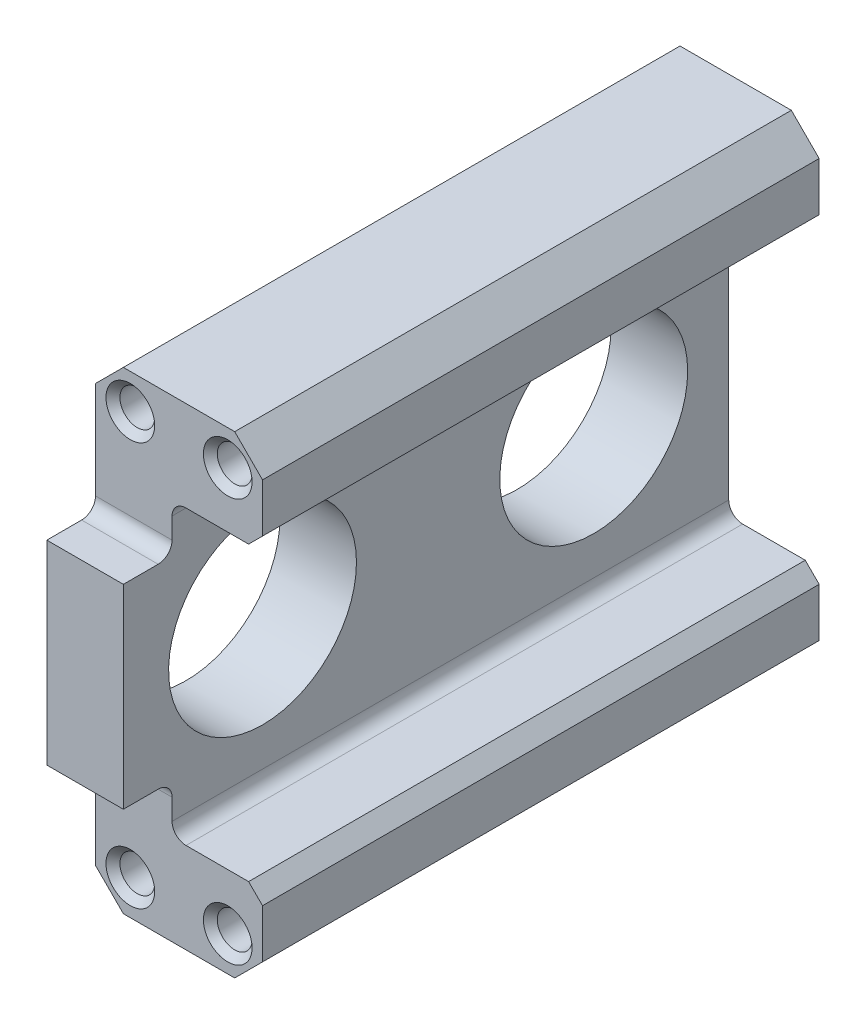
ISO-10303-21;
HEADER;
FILE_DESCRIPTION(('STEP AP214'),'2;1');
FILE_NAME('part.step','',(''),(''),'','','');
FILE_SCHEMA(('AUTOMOTIVE_DESIGN { 1 0 10303 214 1 1 1 1 }'));
ENDSEC;
DATA;
#1=APPLICATION_CONTEXT('core data for automotive mechanical design processes');
#2=APPLICATION_PROTOCOL_DEFINITION('international standard','automotive_design',2000,#1);
#3=PRODUCT_CONTEXT('',#1,'mechanical');
#4=PRODUCT('Part','Part','',(#3));
#5=PRODUCT_RELATED_PRODUCT_CATEGORY('part','',(#4));
#6=PRODUCT_DEFINITION_FORMATION('','',#4);
#7=PRODUCT_DEFINITION_CONTEXT('part definition',#1,'design');
#8=PRODUCT_DEFINITION('design','',#6,#7);
#9=PRODUCT_DEFINITION_SHAPE('','',#8);
#10=(LENGTH_UNIT() NAMED_UNIT(*) SI_UNIT(.MILLI.,.METRE.));
#11=(NAMED_UNIT(*) PLANE_ANGLE_UNIT() SI_UNIT($,.RADIAN.));
#12=(NAMED_UNIT(*) SI_UNIT($,.STERADIAN.) SOLID_ANGLE_UNIT());
#13=UNCERTAINTY_MEASURE_WITH_UNIT(LENGTH_MEASURE(1.E-05),#10,'distance_accuracy_value','');
#14=(GEOMETRIC_REPRESENTATION_CONTEXT(3) GLOBAL_UNCERTAINTY_ASSIGNED_CONTEXT((#13)) GLOBAL_UNIT_ASSIGNED_CONTEXT((#10,
#11,#12)) REPRESENTATION_CONTEXT('',''));
#15=CARTESIAN_POINT('',(0.,0.,0.));
#16=DIRECTION('',(0.,0.,1.));
#17=DIRECTION('',(1.,0.,0.));
#18=AXIS2_PLACEMENT_3D('',#15,#16,#17);
#19=CARTESIAN_POINT('',(6.,-17.,43.5));
#20=DIRECTION('',(-1.,0.,0.));
#21=DIRECTION('',(0.,0.,1.));
#22=AXIS2_PLACEMENT_3D('',#19,#20,#21);
#23=PLANE('',#22);
#24=DIRECTION('',(0.,1.,0.));
#25=VECTOR('',#24,1.);
#26=CARTESIAN_POINT('',(6.,-17.,0.));
#27=LINE('',#26,#25);
#28=CARTESIAN_POINT('',(6.,-15.,0.));
#29=VERTEX_POINT('',#28);
#30=CARTESIAN_POINT('',(6.,-11.5,0.));
#31=VERTEX_POINT('',#30);
#32=EDGE_CURVE('E264',#29,#31,#27,.T.);
#33=ORIENTED_EDGE('',*,*,#32,.T.);
#34=DIRECTION('',(0.,0.,1.));
#35=VECTOR('',#34,1.);
#36=CARTESIAN_POINT('',(6.,-11.5,43.5));
#37=LINE('',#36,#35);
#38=CARTESIAN_POINT('',(6.,-11.5,40.));
#39=VERTEX_POINT('',#38);
#40=EDGE_CURVE('E359',#31,#39,#37,.T.);
#41=ORIENTED_EDGE('',*,*,#40,.T.);
#42=DIRECTION('',(0.,-1.,0.));
#43=VECTOR('',#42,1.);
#44=CARTESIAN_POINT('',(6.,-17.,40.));
#45=LINE('',#44,#43);
#46=CARTESIAN_POINT('',(6.,-15.,40.));
#47=VERTEX_POINT('',#46);
#48=EDGE_CURVE('E230',#39,#47,#45,.T.);
#49=ORIENTED_EDGE('',*,*,#48,.T.);
#50=DIRECTION('',(0.,0.,-1.));
#51=VECTOR('',#50,1.);
#52=CARTESIAN_POINT('',(6.,-15.,43.5));
#53=LINE('',#52,#51);
#54=EDGE_CURVE('E341',#47,#29,#53,.T.);
#55=ORIENTED_EDGE('',*,*,#54,.T.);
#56=EDGE_LOOP('',(#33,#41,#49,#55));
#57=FACE_BOUND('',#56,.T.);
#58=ADVANCED_FACE('F38',(#57),#23,.F.);
#59=DIRECTION('',(0.,1.,0.));
#60=VECTOR('',#59,1.);
#61=CARTESIAN_POINT('',(6.,17.,40.));
#62=LINE('',#61,#60);
#63=CARTESIAN_POINT('',(6.,11.5,40.));
#64=VERTEX_POINT('',#63);
#65=CARTESIAN_POINT('',(6.,15.,40.));
#66=VERTEX_POINT('',#65);
#67=EDGE_CURVE('E245',#64,#66,#62,.T.);
#68=ORIENTED_EDGE('',*,*,#67,.F.);
#69=DIRECTION('',(0.,0.,-1.));
#70=VECTOR('',#69,1.);
#71=CARTESIAN_POINT('',(6.,11.5,43.5));
#72=LINE('',#71,#70);
#73=CARTESIAN_POINT('',(6.,11.5,0.));
#74=VERTEX_POINT('',#73);
#75=EDGE_CURVE('E371',#64,#74,#72,.T.);
#76=ORIENTED_EDGE('',*,*,#75,.T.);
#77=CARTESIAN_POINT('',(6.,15.,0.));
#78=VERTEX_POINT('',#77);
#79=EDGE_CURVE('E261',#74,#78,#27,.T.);
#80=ORIENTED_EDGE('',*,*,#79,.T.);
#81=DIRECTION('',(0.,0.,1.));
#82=VECTOR('',#81,1.);
#83=CARTESIAN_POINT('',(6.,15.,43.5));
#84=LINE('',#83,#82);
#85=EDGE_CURVE('E334',#78,#66,#84,.T.);
#86=ORIENTED_EDGE('',*,*,#85,.T.);
#87=EDGE_LOOP('',(#68,#76,#80,#86));
#88=FACE_BOUND('',#87,.T.);
#89=ADVANCED_FACE('F466',(#88),#23,.F.);
#90=CARTESIAN_POINT('',(-6.,-17.,43.5));
#91=DIRECTION('',(1.,0.,0.));
#92=DIRECTION('',(0.,0.,-1.));
#93=AXIS2_PLACEMENT_3D('',#90,#91,#92);
#94=PLANE('',#93);
#95=CARTESIAN_POINT('',(-6.,0.,33.5));
#96=DIRECTION('',(1.,0.,0.));
#97=DIRECTION('',(0.,0.,-1.));
#98=AXIS2_PLACEMENT_3D('',#95,#96,#97);
#99=CIRCLE('',#98,6.75);
#100=CARTESIAN_POINT('',(-6.,0.,26.75));
#101=VERTEX_POINT('',#100);
#102=EDGE_CURVE('E258',#101,#101,#99,.T.);
#103=ORIENTED_EDGE('',*,*,#102,.T.);
#104=EDGE_LOOP('',(#103));
#105=FACE_BOUND('',#104,.T.);
#106=CARTESIAN_POINT('',(-6.,0.,9.7));
#107=DIRECTION('',(1.,0.,0.));
#108=DIRECTION('',(0.,0.,-1.));
#109=AXIS2_PLACEMENT_3D('',#106,#107,#108);
#110=CIRCLE('',#109,6.75);
#111=CARTESIAN_POINT('',(-6.,0.,2.95));
#112=VERTEX_POINT('',#111);
#113=EDGE_CURVE('E255',#112,#112,#110,.T.);
#114=ORIENTED_EDGE('',*,*,#113,.T.);
#115=EDGE_LOOP('',(#114));
#116=FACE_BOUND('',#115,.T.);
#117=DIRECTION('',(0.,-1.,0.));
#118=VECTOR('',#117,1.);
#119=CARTESIAN_POINT('',(-6.,-17.,0.));
#120=LINE('',#119,#118);
#121=CARTESIAN_POINT('',(-6.,15.,0.));
#122=VERTEX_POINT('',#121);
#123=CARTESIAN_POINT('',(-6.,-15.,0.));
#124=VERTEX_POINT('',#123);
#125=EDGE_CURVE('E270',#122,#124,#120,.T.);
#126=ORIENTED_EDGE('',*,*,#125,.T.);
#127=DIRECTION('',(0.,0.,1.));
#128=VECTOR('',#127,1.);
#129=CARTESIAN_POINT('',(-6.,-15.,43.5));
#130=LINE('',#129,#128);
#131=CARTESIAN_POINT('',(-6.,-15.,40.));
#132=VERTEX_POINT('',#131);
#133=EDGE_CURVE('E357',#124,#132,#130,.T.);
#134=ORIENTED_EDGE('',*,*,#133,.T.);
#135=DIRECTION('',(0.,1.,0.));
#136=VECTOR('',#135,1.);
#137=CARTESIAN_POINT('',(-6.,-17.,40.));
#138=LINE('',#137,#136);
#139=CARTESIAN_POINT('',(-6.,-8.,40.));
#140=VERTEX_POINT('',#139);
#141=EDGE_CURVE('E233',#132,#140,#138,.T.);
#142=ORIENTED_EDGE('',*,*,#141,.T.);
#143=CARTESIAN_POINT('',(-6.,-8.,41.));
#144=DIRECTION('',(1.,0.,0.));
#145=DIRECTION('',(0.,0.,-1.));
#146=AXIS2_PLACEMENT_3D('',#143,#144,#145);
#147=CIRCLE('',#146,1.);
#148=CARTESIAN_POINT('',(-6.,-7.,41.));
#149=VERTEX_POINT('',#148);
#150=EDGE_CURVE('E284',#140,#149,#147,.T.);
#151=ORIENTED_EDGE('',*,*,#150,.T.);
#152=DIRECTION('',(0.,0.,1.));
#153=VECTOR('',#152,1.);
#154=CARTESIAN_POINT('',(-6.,-7.,40.));
#155=LINE('',#154,#153);
#156=CARTESIAN_POINT('',(-6.,-7.,43.5));
#157=VERTEX_POINT('',#156);
#158=EDGE_CURVE('E242',#149,#157,#155,.T.);
#159=ORIENTED_EDGE('',*,*,#158,.T.);
#160=DIRECTION('',(0.,-1.,0.));
#161=VECTOR('',#160,1.);
#162=CARTESIAN_POINT('',(-6.,-17.,43.5));
#163=LINE('',#162,#161);
#164=CARTESIAN_POINT('',(-6.,7.,43.5));
#165=VERTEX_POINT('',#164);
#166=EDGE_CURVE('E229',#165,#157,#163,.T.);
#167=ORIENTED_EDGE('',*,*,#166,.F.);
#168=DIRECTION('',(0.,0.,1.));
#169=VECTOR('',#168,1.);
#170=CARTESIAN_POINT('',(-6.,7.,40.));
#171=LINE('',#170,#169);
#172=CARTESIAN_POINT('',(-6.,7.,41.));
#173=VERTEX_POINT('',#172);
#174=EDGE_CURVE('E252',#173,#165,#171,.T.);
#175=ORIENTED_EDGE('',*,*,#174,.F.);
#176=CARTESIAN_POINT('',(-6.,8.,41.));
#177=DIRECTION('',(1.,0.,0.));
#178=DIRECTION('',(0.,0.,-1.));
#179=AXIS2_PLACEMENT_3D('',#176,#177,#178);
#180=CIRCLE('',#179,1.);
#181=CARTESIAN_POINT('',(-6.,8.,40.));
#182=VERTEX_POINT('',#181);
#183=EDGE_CURVE('E286',#173,#182,#180,.T.);
#184=ORIENTED_EDGE('',*,*,#183,.T.);
#185=DIRECTION('',(0.,-1.,0.));
#186=VECTOR('',#185,1.);
#187=CARTESIAN_POINT('',(-6.,17.,40.));
#188=LINE('',#187,#186);
#189=CARTESIAN_POINT('',(-6.,15.,40.));
#190=VERTEX_POINT('',#189);
#191=EDGE_CURVE('E250',#190,#182,#188,.T.);
#192=ORIENTED_EDGE('',*,*,#191,.F.);
#193=DIRECTION('',(0.,0.,-1.));
#194=VECTOR('',#193,1.);
#195=CARTESIAN_POINT('',(-6.,15.,43.5));
#196=LINE('',#195,#194);
#197=EDGE_CURVE('E354',#190,#122,#196,.T.);
#198=ORIENTED_EDGE('',*,*,#197,.T.);
#199=EDGE_LOOP('',(#126,#134,#142,#151,#159,#167,#175,#184,#192,#198));
#200=FACE_BOUND('',#199,.T.);
#201=ADVANCED_FACE('F447',(#105,#116,#200),#94,.F.);
#202=CARTESIAN_POINT('',(0.,0.,43.5));
#203=DIRECTION('',(0.,0.,-1.));
#204=DIRECTION('',(-1.,0.,0.));
#205=AXIS2_PLACEMENT_3D('',#202,#203,#204);
#206=PLANE('',#205);
#207=DIRECTION('',(1.,0.,0.));
#208=VECTOR('',#207,1.);
#209=CARTESIAN_POINT('',(6.,-7.,43.5));
#210=LINE('',#209,#208);
#211=CARTESIAN_POINT('',(-0.499999999999998,-7.,43.5));
#212=VERTEX_POINT('',#211);
#213=EDGE_CURVE('E220',#157,#212,#210,.T.);
#214=ORIENTED_EDGE('',*,*,#213,.T.);
#215=DIRECTION('',(0.,1.,0.));
#216=VECTOR('',#215,1.);
#217=CARTESIAN_POINT('',(-0.499999999999995,10.5,43.5));
#218=LINE('',#217,#216);
#219=CARTESIAN_POINT('',(-0.499999999999996,7.,43.5));
#220=VERTEX_POINT('',#219);
#221=EDGE_CURVE('E198',#212,#220,#218,.T.);
#222=ORIENTED_EDGE('',*,*,#221,.T.);
#223=DIRECTION('',(1.,0.,0.));
#224=VECTOR('',#223,1.);
#225=CARTESIAN_POINT('',(6.,7.,43.5));
#226=LINE('',#225,#224);
#227=EDGE_CURVE('E244',#165,#220,#226,.T.);
#228=ORIENTED_EDGE('',*,*,#227,.F.);
#229=ORIENTED_EDGE('',*,*,#166,.T.);
#230=EDGE_LOOP('',(#214,#222,#228,#229));
#231=FACE_BOUND('',#230,.T.);
#232=ADVANCED_FACE('F227',(#231),#206,.F.);
#233=CARTESIAN_POINT('',(-6.,17.,43.5));
#234=DIRECTION('',(0.,-1.,0.));
#235=DIRECTION('',(0.,0.,-1.));
#236=AXIS2_PLACEMENT_3D('',#233,#234,#235);
#237=PLANE('',#236);
#238=DIRECTION('',(-1.,0.,0.));
#239=VECTOR('',#238,1.);
#240=CARTESIAN_POINT('',(6.,17.,40.));
#241=LINE('',#240,#239);
#242=CARTESIAN_POINT('',(4.,17.,40.));
#243=VERTEX_POINT('',#242);
#244=CARTESIAN_POINT('',(-4.,17.,40.));
#245=VERTEX_POINT('',#244);
#246=EDGE_CURVE('E247',#243,#245,#241,.T.);
#247=ORIENTED_EDGE('',*,*,#246,.F.);
#248=DIRECTION('',(0.,0.,-1.));
#249=VECTOR('',#248,1.);
#250=CARTESIAN_POINT('',(4.,17.,43.5));
#251=LINE('',#250,#249);
#252=CARTESIAN_POINT('',(4.,17.,0.));
#253=VERTEX_POINT('',#252);
#254=EDGE_CURVE('E322',#243,#253,#251,.T.);
#255=ORIENTED_EDGE('',*,*,#254,.T.);
#256=DIRECTION('',(-1.,0.,0.));
#257=VECTOR('',#256,1.);
#258=CARTESIAN_POINT('',(-6.,17.,0.));
#259=LINE('',#258,#257);
#260=CARTESIAN_POINT('',(-4.,17.,0.));
#261=VERTEX_POINT('',#260);
#262=EDGE_CURVE('E267',#253,#261,#259,.T.);
#263=ORIENTED_EDGE('',*,*,#262,.T.);
#264=DIRECTION('',(0.,0.,1.));
#265=VECTOR('',#264,1.);
#266=CARTESIAN_POINT('',(-4.,17.,43.5));
#267=LINE('',#266,#265);
#268=EDGE_CURVE('E320',#261,#245,#267,.T.);
#269=ORIENTED_EDGE('',*,*,#268,.T.);
#270=EDGE_LOOP('',(#247,#255,#263,#269));
#271=FACE_BOUND('',#270,.T.);
#272=ADVANCED_FACE('F457',(#271),#237,.F.);
#273=CARTESIAN_POINT('',(-6.,-17.,43.5));
#274=DIRECTION('',(0.,1.,0.));
#275=DIRECTION('',(0.,0.,1.));
#276=AXIS2_PLACEMENT_3D('',#273,#274,#275);
#277=PLANE('',#276);
#278=DIRECTION('',(1.,0.,0.));
#279=VECTOR('',#278,1.);
#280=CARTESIAN_POINT('',(-6.,-17.,0.));
#281=LINE('',#280,#279);
#282=CARTESIAN_POINT('',(-4.,-17.,0.));
#283=VERTEX_POINT('',#282);
#284=CARTESIAN_POINT('',(3.99999999999999,-17.,0.));
#285=VERTEX_POINT('',#284);
#286=EDGE_CURVE('E263',#283,#285,#281,.T.);
#287=ORIENTED_EDGE('',*,*,#286,.T.);
#288=DIRECTION('',(0.,0.,1.));
#289=VECTOR('',#288,1.);
#290=CARTESIAN_POINT('',(3.99999999999999,-17.,43.5));
#291=LINE('',#290,#289);
#292=CARTESIAN_POINT('',(3.99999999999999,-17.,40.));
#293=VERTEX_POINT('',#292);
#294=EDGE_CURVE('E347',#285,#293,#291,.T.);
#295=ORIENTED_EDGE('',*,*,#294,.T.);
#296=DIRECTION('',(-1.,0.,0.));
#297=VECTOR('',#296,1.);
#298=CARTESIAN_POINT('',(6.,-17.,40.));
#299=LINE('',#298,#297);
#300=CARTESIAN_POINT('',(-4.,-17.,40.));
#301=VERTEX_POINT('',#300);
#302=EDGE_CURVE('E240',#293,#301,#299,.T.);
#303=ORIENTED_EDGE('',*,*,#302,.T.);
#304=DIRECTION('',(0.,0.,-1.));
#305=VECTOR('',#304,1.);
#306=CARTESIAN_POINT('',(-4.,-17.,43.5));
#307=LINE('',#306,#305);
#308=EDGE_CURVE('E344',#301,#283,#307,.T.);
#309=ORIENTED_EDGE('',*,*,#308,.T.);
#310=EDGE_LOOP('',(#287,#295,#303,#309));
#311=FACE_BOUND('',#310,.T.);
#312=ADVANCED_FACE('F437',(#311),#277,.F.);
#313=CARTESIAN_POINT('',(0.,0.,0.));
#314=DIRECTION('',(0.,0.,-1.));
#315=DIRECTION('',(-1.,0.,0.));
#316=AXIS2_PLACEMENT_3D('',#313,#314,#315);
#317=PLANE('',#316);
#318=DIRECTION('',(-1.,0.,0.));
#319=VECTOR('',#318,1.);
#320=CARTESIAN_POINT('',(12.5,-10.5,0.));
#321=LINE('',#320,#319);
#322=CARTESIAN_POINT('',(5.,-10.5,0.));
#323=VERTEX_POINT('',#322);
#324=CARTESIAN_POINT('',(0.500000000000006,-10.5,0.));
#325=VERTEX_POINT('',#324);
#326=EDGE_CURVE('E213',#323,#325,#321,.T.);
#327=ORIENTED_EDGE('',*,*,#326,.F.);
#328=DIRECTION('',(-0.70710678118655,0.707106781186545,0.));
#329=VECTOR('',#328,1.);
#330=CARTESIAN_POINT('',(-2.75000000000002,-2.75000000000004,0.));
#331=LINE('',#330,#329);
#332=EDGE_CURVE('E369',#323,#31,#331,.F.);
#333=ORIENTED_EDGE('',*,*,#332,.T.);
#334=ORIENTED_EDGE('',*,*,#32,.F.);
#335=DIRECTION('',(0.707106781186549,0.707106781186546,0.));
#336=VECTOR('',#335,1.);
#337=CARTESIAN_POINT('',(10.5,-10.5,0.));
#338=LINE('',#337,#336);
#339=EDGE_CURVE('E329',#29,#285,#338,.F.);
#340=ORIENTED_EDGE('',*,*,#339,.T.);
#341=ORIENTED_EDGE('',*,*,#286,.F.);
#342=DIRECTION('',(0.707106781186546,-0.707106781186549,0.));
#343=VECTOR('',#342,1.);
#344=CARTESIAN_POINT('',(-10.5,-10.5,0.));
#345=LINE('',#344,#343);
#346=EDGE_CURVE('E327',#283,#124,#345,.F.);
#347=ORIENTED_EDGE('',*,*,#346,.T.);
#348=ORIENTED_EDGE('',*,*,#125,.F.);
#349=DIRECTION('',(-0.707106781186549,-0.707106781186546,0.));
#350=VECTOR('',#349,1.);
#351=CARTESIAN_POINT('',(-10.5,10.5,0.));
#352=LINE('',#351,#350);
#353=EDGE_CURVE('E325',#122,#261,#352,.F.);
#354=ORIENTED_EDGE('',*,*,#353,.T.);
#355=ORIENTED_EDGE('',*,*,#262,.F.);
#356=DIRECTION('',(-0.707106781186546,0.707106781186549,0.));
#357=VECTOR('',#356,1.);
#358=CARTESIAN_POINT('',(10.5,10.5,0.));
#359=LINE('',#358,#357);
#360=EDGE_CURVE('E331',#253,#78,#359,.F.);
#361=ORIENTED_EDGE('',*,*,#360,.T.);
#362=ORIENTED_EDGE('',*,*,#79,.F.);
#363=DIRECTION('',(0.70710678118655,0.707106781186545,0.));
#364=VECTOR('',#363,1.);
#365=CARTESIAN_POINT('',(-2.75000000000002,2.75000000000004,0.));
#366=LINE('',#365,#364);
#367=CARTESIAN_POINT('',(5.,10.5,0.));
#368=VERTEX_POINT('',#367);
#369=EDGE_CURVE('E366',#74,#368,#366,.F.);
#370=ORIENTED_EDGE('',*,*,#369,.T.);
#371=DIRECTION('',(1.,0.,0.));
#372=VECTOR('',#371,1.);
#373=CARTESIAN_POINT('',(12.5,10.5,0.));
#374=LINE('',#373,#372);
#375=CARTESIAN_POINT('',(0.500000000000004,10.5,0.));
#376=VERTEX_POINT('',#375);
#377=EDGE_CURVE('E407',#376,#368,#374,.T.);
#378=ORIENTED_EDGE('',*,*,#377,.F.);
#379=CARTESIAN_POINT('',(0.500000000000004,9.5,0.));
#380=DIRECTION('',(0.,0.,-1.));
#381=DIRECTION('',(-1.,0.,0.));
#382=AXIS2_PLACEMENT_3D('',#379,#380,#381);
#383=CIRCLE('',#382,1.);
#384=CARTESIAN_POINT('',(-0.499999999999995,9.5,0.));
#385=VERTEX_POINT('',#384);
#386=EDGE_CURVE('E388',#376,#385,#383,.F.);
#387=ORIENTED_EDGE('',*,*,#386,.T.);
#388=DIRECTION('',(0.,1.,0.));
#389=VECTOR('',#388,1.);
#390=CARTESIAN_POINT('',(-0.499999999999995,10.5,0.));
#391=LINE('',#390,#389);
#392=CARTESIAN_POINT('',(-0.499999999999999,-9.49999999999999,0.));
#393=VERTEX_POINT('',#392);
#394=EDGE_CURVE('E406',#393,#385,#391,.T.);
#395=ORIENTED_EDGE('',*,*,#394,.F.);
#396=CARTESIAN_POINT('',(0.500000000000002,-9.5,0.));
#397=DIRECTION('',(0.,0.,-1.));
#398=DIRECTION('',(-1.,0.,0.));
#399=AXIS2_PLACEMENT_3D('',#396,#397,#398);
#400=CIRCLE('',#399,1.);
#401=EDGE_CURVE('E46',#393,#325,#400,.F.);
#402=ORIENTED_EDGE('',*,*,#401,.T.);
#403=EDGE_LOOP('',(#327,#333,#334,#340,#341,#347,#348,#354,#355,#361,#362,#370,#378,#387,#395,#402));
#404=FACE_BOUND('',#403,.T.);
#405=ADVANCED_FACE('F405',(#404),#317,.T.);
#406=CARTESIAN_POINT('',(-6.,0.,33.5));
#407=DIRECTION('',(1.,0.,0.));
#408=DIRECTION('',(0.,0.,-1.));
#409=AXIS2_PLACEMENT_3D('',#406,#407,#408);
#410=CYLINDRICAL_SURFACE('',#409,6.75);
#411=CARTESIAN_POINT('',(-0.499999999999997,0.,33.5));
#412=DIRECTION('',(-1.,0.,0.));
#413=DIRECTION('',(0.,-1.,0.));
#414=AXIS2_PLACEMENT_3D('',#411,#412,#413);
#415=CIRCLE('',#414,6.75);
#416=CARTESIAN_POINT('',(-0.499999999999998,-6.75,33.5));
#417=VERTEX_POINT('',#416);
#418=EDGE_CURVE('E421',#417,#417,#415,.F.);
#419=ORIENTED_EDGE('',*,*,#418,.T.);
#420=EDGE_LOOP('',(#419));
#421=FACE_BOUND('',#420,.T.);
#422=ORIENTED_EDGE('',*,*,#102,.F.);
#423=EDGE_LOOP('',(#422));
#424=FACE_BOUND('',#423,.T.);
#425=ADVANCED_FACE('F577',(#421,#424),#410,.F.);
#426=CARTESIAN_POINT('',(-6.,0.,9.7));
#427=DIRECTION('',(1.,0.,0.));
#428=DIRECTION('',(0.,0.,-1.));
#429=AXIS2_PLACEMENT_3D('',#426,#427,#428);
#430=CYLINDRICAL_SURFACE('',#429,6.75);
#431=CARTESIAN_POINT('',(-0.499999999999997,0.,9.7));
#432=DIRECTION('',(-1.,0.,0.));
#433=DIRECTION('',(0.,-1.,0.));
#434=AXIS2_PLACEMENT_3D('',#431,#432,#433);
#435=CIRCLE('',#434,6.75);
#436=CARTESIAN_POINT('',(-0.499999999999998,-6.75,9.7));
#437=VERTEX_POINT('',#436);
#438=EDGE_CURVE('E224',#437,#437,#435,.F.);
#439=ORIENTED_EDGE('',*,*,#438,.T.);
#440=EDGE_LOOP('',(#439));
#441=FACE_BOUND('',#440,.T.);
#442=ORIENTED_EDGE('',*,*,#113,.F.);
#443=EDGE_LOOP('',(#442));
#444=FACE_BOUND('',#443,.T.);
#445=ADVANCED_FACE('F574',(#441,#444),#430,.F.);
#446=CARTESIAN_POINT('',(6.,7.,40.));
#447=DIRECTION('',(0.,-1.,0.));
#448=DIRECTION('',(1.,0.,0.));
#449=AXIS2_PLACEMENT_3D('',#446,#447,#448);
#450=PLANE('',#449);
#451=ORIENTED_EDGE('',*,*,#227,.T.);
#452=DIRECTION('',(0.,0.,-1.));
#453=VECTOR('',#452,1.);
#454=CARTESIAN_POINT('',(-0.499999999999996,7.,40.));
#455=LINE('',#454,#453);
#456=CARTESIAN_POINT('',(-0.499999999999996,7.,41.));
#457=VERTEX_POINT('',#456);
#458=EDGE_CURVE('E207',#220,#457,#455,.T.);
#459=ORIENTED_EDGE('',*,*,#458,.T.);
#460=DIRECTION('',(1.,0.,0.));
#461=VECTOR('',#460,1.);
#462=CARTESIAN_POINT('',(-6.,7.,41.));
#463=LINE('',#462,#461);
#464=EDGE_CURVE('E282',#457,#173,#463,.F.);
#465=ORIENTED_EDGE('',*,*,#464,.T.);
#466=ORIENTED_EDGE('',*,*,#174,.T.);
#467=EDGE_LOOP('',(#451,#459,#465,#466));
#468=FACE_BOUND('',#467,.T.);
#469=ADVANCED_FACE('F477',(#468),#450,.F.);
#470=CARTESIAN_POINT('',(0.,0.,40.));
#471=DIRECTION('',(0.,0.,-1.));
#472=DIRECTION('',(-1.,0.,0.));
#473=AXIS2_PLACEMENT_3D('',#470,#471,#472);
#474=PLANE('',#473);
#475=CARTESIAN_POINT('',(-3.5,14.5,40.));
#476=DIRECTION('',(0.,0.,-1.));
#477=DIRECTION('',(-1.,0.,0.));
#478=AXIS2_PLACEMENT_3D('',#475,#476,#477);
#479=CIRCLE('',#478,1.74999999999999);
#480=CARTESIAN_POINT('',(-5.24999999999999,14.5,40.));
#481=VERTEX_POINT('',#480);
#482=EDGE_CURVE('E307',#481,#481,#479,.T.);
#483=ORIENTED_EDGE('',*,*,#482,.T.);
#484=EDGE_LOOP('',(#483));
#485=FACE_BOUND('',#484,.T.);
#486=CARTESIAN_POINT('',(3.5,14.5,40.));
#487=DIRECTION('',(0.,0.,-1.));
#488=DIRECTION('',(-1.,0.,0.));
#489=AXIS2_PLACEMENT_3D('',#486,#487,#488);
#490=CIRCLE('',#489,1.74999999999999);
#491=CARTESIAN_POINT('',(1.75000000000001,14.5,40.));
#492=VERTEX_POINT('',#491);
#493=EDGE_CURVE('E304',#492,#492,#490,.T.);
#494=ORIENTED_EDGE('',*,*,#493,.T.);
#495=EDGE_LOOP('',(#494));
#496=FACE_BOUND('',#495,.T.);
#497=DIRECTION('',(0.,1.,0.));
#498=VECTOR('',#497,1.);
#499=CARTESIAN_POINT('',(-0.499999999999997,0.,40.));
#500=LINE('',#499,#498);
#501=CARTESIAN_POINT('',(-0.499999999999996,8.,40.));
#502=VERTEX_POINT('',#501);
#503=CARTESIAN_POINT('',(-0.499999999999995,9.5,40.));
#504=VERTEX_POINT('',#503);
#505=EDGE_CURVE('E212',#502,#504,#500,.T.);
#506=ORIENTED_EDGE('',*,*,#505,.T.);
#507=CARTESIAN_POINT('',(0.500000000000004,9.5,40.));
#508=DIRECTION('',(0.,0.,-1.));
#509=DIRECTION('',(-1.,0.,0.));
#510=AXIS2_PLACEMENT_3D('',#507,#508,#509);
#511=CIRCLE('',#510,1.);
#512=CARTESIAN_POINT('',(0.500000000000004,10.5,40.));
#513=VERTEX_POINT('',#512);
#514=EDGE_CURVE('E390',#504,#513,#511,.T.);
#515=ORIENTED_EDGE('',*,*,#514,.T.);
#516=DIRECTION('',(1.,0.,0.));
#517=VECTOR('',#516,1.);
#518=CARTESIAN_POINT('',(0.,10.5,40.));
#519=LINE('',#518,#517);
#520=CARTESIAN_POINT('',(5.,10.5,40.));
#521=VERTEX_POINT('',#520);
#522=EDGE_CURVE('E318',#513,#521,#519,.T.);
#523=ORIENTED_EDGE('',*,*,#522,.T.);
#524=DIRECTION('',(-0.70710678118655,-0.707106781186545,0.));
#525=VECTOR('',#524,1.);
#526=CARTESIAN_POINT('',(6.,11.5,40.));
#527=LINE('',#526,#525);
#528=EDGE_CURVE('E377',#521,#64,#527,.F.);
#529=ORIENTED_EDGE('',*,*,#528,.T.);
#530=ORIENTED_EDGE('',*,*,#67,.T.);
#531=DIRECTION('',(0.707106781186546,-0.707106781186549,0.));
#532=VECTOR('',#531,1.);
#533=CARTESIAN_POINT('',(4.,17.,40.));
#534=LINE('',#533,#532);
#535=EDGE_CURVE('E339',#66,#243,#534,.F.);
#536=ORIENTED_EDGE('',*,*,#535,.T.);
#537=ORIENTED_EDGE('',*,*,#246,.T.);
#538=DIRECTION('',(0.707106781186549,0.707106781186546,0.));
#539=VECTOR('',#538,1.);
#540=CARTESIAN_POINT('',(-6.,15.,40.));
#541=LINE('',#540,#539);
#542=EDGE_CURVE('E337',#245,#190,#541,.F.);
#543=ORIENTED_EDGE('',*,*,#542,.T.);
#544=ORIENTED_EDGE('',*,*,#191,.T.);
#545=DIRECTION('',(1.,0.,0.));
#546=VECTOR('',#545,1.);
#547=CARTESIAN_POINT('',(6.,8.,40.));
#548=LINE('',#547,#546);
#549=EDGE_CURVE('E279',#182,#502,#548,.T.);
#550=ORIENTED_EDGE('',*,*,#549,.T.);
#551=EDGE_LOOP('',(#506,#515,#523,#529,#530,#536,#537,#543,#544,#550));
#552=FACE_BOUND('',#551,.T.);
#553=ADVANCED_FACE('F395',(#485,#496,#552),#474,.F.);
#554=CARTESIAN_POINT('',(6.,-7.,40.));
#555=DIRECTION('',(0.,-1.,0.));
#556=DIRECTION('',(1.,0.,0.));
#557=AXIS2_PLACEMENT_3D('',#554,#555,#556);
#558=PLANE('',#557);
#559=DIRECTION('',(0.,0.,-1.));
#560=VECTOR('',#559,1.);
#561=CARTESIAN_POINT('',(-0.499999999999998,-7.,40.));
#562=LINE('',#561,#560);
#563=CARTESIAN_POINT('',(-0.499999999999999,-7.,41.));
#564=VERTEX_POINT('',#563);
#565=EDGE_CURVE('E204',#212,#564,#562,.T.);
#566=ORIENTED_EDGE('',*,*,#565,.F.);
#567=ORIENTED_EDGE('',*,*,#213,.F.);
#568=ORIENTED_EDGE('',*,*,#158,.F.);
#569=DIRECTION('',(1.,0.,0.));
#570=VECTOR('',#569,1.);
#571=CARTESIAN_POINT('',(6.,-7.,41.));
#572=LINE('',#571,#570);
#573=EDGE_CURVE('E223',#149,#564,#572,.T.);
#574=ORIENTED_EDGE('',*,*,#573,.T.);
#575=EDGE_LOOP('',(#566,#567,#568,#574));
#576=FACE_BOUND('',#575,.T.);
#577=ADVANCED_FACE('F218',(#576),#558,.T.);
#578=CARTESIAN_POINT('',(0.,0.,40.));
#579=DIRECTION('',(0.,0.,-1.));
#580=DIRECTION('',(-1.,0.,0.));
#581=AXIS2_PLACEMENT_3D('',#578,#579,#580);
#582=PLANE('',#581);
#583=CARTESIAN_POINT('',(-3.5,-14.5,40.));
#584=DIRECTION('',(0.,0.,-1.));
#585=DIRECTION('',(-1.,0.,0.));
#586=AXIS2_PLACEMENT_3D('',#583,#584,#585);
#587=CIRCLE('',#586,1.74999999999999);
#588=CARTESIAN_POINT('',(-5.24999999999999,-14.5,40.));
#589=VERTEX_POINT('',#588);
#590=EDGE_CURVE('E295',#589,#589,#587,.T.);
#591=ORIENTED_EDGE('',*,*,#590,.T.);
#592=EDGE_LOOP('',(#591));
#593=FACE_BOUND('',#592,.T.);
#594=CARTESIAN_POINT('',(3.5,-14.5,40.));
#595=DIRECTION('',(0.,0.,-1.));
#596=DIRECTION('',(-1.,0.,0.));
#597=AXIS2_PLACEMENT_3D('',#594,#595,#596);
#598=CIRCLE('',#597,1.74999999999999);
#599=CARTESIAN_POINT('',(1.75000000000001,-14.5,40.));
#600=VERTEX_POINT('',#599);
#601=EDGE_CURVE('E292',#600,#600,#598,.T.);
#602=ORIENTED_EDGE('',*,*,#601,.T.);
#603=EDGE_LOOP('',(#602));
#604=FACE_BOUND('',#603,.T.);
#605=ORIENTED_EDGE('',*,*,#48,.F.);
#606=DIRECTION('',(0.70710678118655,-0.707106781186545,0.));
#607=VECTOR('',#606,1.);
#608=CARTESIAN_POINT('',(6.,-11.5,40.));
#609=LINE('',#608,#607);
#610=CARTESIAN_POINT('',(5.,-10.5,40.));
#611=VERTEX_POINT('',#610);
#612=EDGE_CURVE('E362',#39,#611,#609,.F.);
#613=ORIENTED_EDGE('',*,*,#612,.T.);
#614=DIRECTION('',(-1.,0.,0.));
#615=VECTOR('',#614,1.);
#616=CARTESIAN_POINT('',(0.,-10.5,40.));
#617=LINE('',#616,#615);
#618=CARTESIAN_POINT('',(0.500000000000002,-10.5,40.));
#619=VERTEX_POINT('',#618);
#620=EDGE_CURVE('E316',#611,#619,#617,.T.);
#621=ORIENTED_EDGE('',*,*,#620,.T.);
#622=CARTESIAN_POINT('',(0.500000000000002,-9.5,40.));
#623=DIRECTION('',(0.,0.,-1.));
#624=DIRECTION('',(-1.,0.,0.));
#625=AXIS2_PLACEMENT_3D('',#622,#623,#624);
#626=CIRCLE('',#625,1.);
#627=CARTESIAN_POINT('',(-0.499999999999999,-9.5,40.));
#628=VERTEX_POINT('',#627);
#629=EDGE_CURVE('E11',#619,#628,#626,.T.);
#630=ORIENTED_EDGE('',*,*,#629,.T.);
#631=DIRECTION('',(0.,1.,0.));
#632=VECTOR('',#631,1.);
#633=CARTESIAN_POINT('',(-0.499999999999997,0.,40.));
#634=LINE('',#633,#632);
#635=CARTESIAN_POINT('',(-0.499999999999999,-8.,40.));
#636=VERTEX_POINT('',#635);
#637=EDGE_CURVE('E225',#628,#636,#634,.T.);
#638=ORIENTED_EDGE('',*,*,#637,.T.);
#639=DIRECTION('',(1.,0.,0.));
#640=VECTOR('',#639,1.);
#641=CARTESIAN_POINT('',(0.,-8.,40.));
#642=LINE('',#641,#640);
#643=EDGE_CURVE('E276',#636,#140,#642,.F.);
#644=ORIENTED_EDGE('',*,*,#643,.T.);
#645=ORIENTED_EDGE('',*,*,#141,.F.);
#646=DIRECTION('',(-0.707106781186546,0.707106781186549,0.));
#647=VECTOR('',#646,1.);
#648=CARTESIAN_POINT('',(-4.,-17.,40.));
#649=LINE('',#648,#647);
#650=EDGE_CURVE('E349',#132,#301,#649,.F.);
#651=ORIENTED_EDGE('',*,*,#650,.T.);
#652=ORIENTED_EDGE('',*,*,#302,.F.);
#653=DIRECTION('',(-0.707106781186549,-0.707106781186546,0.));
#654=VECTOR('',#653,1.);
#655=CARTESIAN_POINT('',(6.,-15.,40.));
#656=LINE('',#655,#654);
#657=EDGE_CURVE('E351',#293,#47,#656,.F.);
#658=ORIENTED_EDGE('',*,*,#657,.T.);
#659=EDGE_LOOP('',(#605,#613,#621,#630,#638,#644,#645,#651,#652,#658));
#660=FACE_BOUND('',#659,.T.);
#661=ADVANCED_FACE('F485',(#593,#604,#660),#582,.F.);
#662=CARTESIAN_POINT('',(6.,-8.,41.));
#663=DIRECTION('',(1.,0.,0.));
#664=DIRECTION('',(0.,1.,0.));
#665=AXIS2_PLACEMENT_3D('',#662,#663,#664);
#666=CYLINDRICAL_SURFACE('',#665,1.);
#667=ORIENTED_EDGE('',*,*,#643,.F.);
#668=CARTESIAN_POINT('',(-0.499999999999999,-8.,41.));
#669=DIRECTION('',(-1.,0.,0.));
#670=DIRECTION('',(0.,-1.,0.));
#671=AXIS2_PLACEMENT_3D('',#668,#669,#670);
#672=CIRCLE('',#671,1.);
#673=EDGE_CURVE('E416',#636,#564,#672,.F.);
#674=ORIENTED_EDGE('',*,*,#673,.T.);
#675=ORIENTED_EDGE('',*,*,#573,.F.);
#676=ORIENTED_EDGE('',*,*,#150,.F.);
#677=EDGE_LOOP('',(#667,#674,#675,#676));
#678=FACE_BOUND('',#677,.T.);
#679=ADVANCED_FACE('F481',(#678),#666,.F.);
#680=CARTESIAN_POINT('',(0.,8.,41.));
#681=DIRECTION('',(-1.,0.,0.));
#682=DIRECTION('',(0.,-1.,0.));
#683=AXIS2_PLACEMENT_3D('',#680,#681,#682);
#684=CYLINDRICAL_SURFACE('',#683,1.);
#685=ORIENTED_EDGE('',*,*,#464,.F.);
#686=CARTESIAN_POINT('',(-0.499999999999996,8.,41.));
#687=DIRECTION('',(-1.,0.,0.));
#688=DIRECTION('',(0.,-1.,0.));
#689=AXIS2_PLACEMENT_3D('',#686,#687,#688);
#690=CIRCLE('',#689,1.);
#691=EDGE_CURVE('E313',#457,#502,#690,.F.);
#692=ORIENTED_EDGE('',*,*,#691,.T.);
#693=ORIENTED_EDGE('',*,*,#549,.F.);
#694=ORIENTED_EDGE('',*,*,#183,.F.);
#695=EDGE_LOOP('',(#685,#692,#693,#694));
#696=FACE_BOUND('',#695,.T.);
#697=ADVANCED_FACE('F475',(#696),#684,.F.);
#698=CARTESIAN_POINT('',(-3.5,14.5,30.5));
#699=DIRECTION('',(0.,0.,1.));
#700=DIRECTION('',(1.,0.,0.));
#701=AXIS2_PLACEMENT_3D('',#698,#699,#700);
#702=CONICAL_SURFACE('',#701,1.25,1.02974425867665);
#703=CARTESIAN_POINT('',(-3.5,14.5,29.7489242262155));
#704=VERTEX_POINT('',#703);
#705=VERTEX_LOOP('',#704);
#706=FACE_BOUND('',#705,.T.);
#707=CARTESIAN_POINT('',(-3.5,14.5,30.5));
#708=DIRECTION('',(0.,0.,1.));
#709=DIRECTION('',(1.,0.,0.));
#710=AXIS2_PLACEMENT_3D('',#707,#708,#709);
#711=CIRCLE('',#710,1.25);
#712=CARTESIAN_POINT('',(-2.25,14.5,30.5));
#713=VERTEX_POINT('',#712);
#714=EDGE_CURVE('E231',#713,#713,#711,.T.);
#715=ORIENTED_EDGE('',*,*,#714,.T.);
#716=EDGE_LOOP('',(#715));
#717=FACE_BOUND('',#716,.T.);
#718=ADVANCED_FACE('F517',(#706,#717),#702,.F.);
#719=CARTESIAN_POINT('',(-3.5,14.5,40.));
#720=DIRECTION('',(0.,0.,1.));
#721=DIRECTION('',(1.,0.,0.));
#722=AXIS2_PLACEMENT_3D('',#719,#720,#721);
#723=CYLINDRICAL_SURFACE('',#722,1.24999999999999);
#724=CARTESIAN_POINT('',(-3.5,14.5,39.5));
#725=DIRECTION('',(0.,0.,-1.));
#726=DIRECTION('',(-1.,0.,0.));
#727=AXIS2_PLACEMENT_3D('',#724,#725,#726);
#728=CIRCLE('',#727,1.24999999999999);
#729=CARTESIAN_POINT('',(-4.75,14.5,39.5));
#730=VERTEX_POINT('',#729);
#731=EDGE_CURVE('E301',#730,#730,#728,.F.);
#732=ORIENTED_EDGE('',*,*,#731,.T.);
#733=EDGE_LOOP('',(#732));
#734=FACE_BOUND('',#733,.T.);
#735=ORIENTED_EDGE('',*,*,#714,.F.);
#736=EDGE_LOOP('',(#735));
#737=FACE_BOUND('',#736,.T.);
#738=ADVANCED_FACE('F551',(#734,#737),#723,.F.);
#739=CARTESIAN_POINT('',(3.5,14.5,30.5));
#740=DIRECTION('',(0.,0.,1.));
#741=DIRECTION('',(1.,0.,0.));
#742=AXIS2_PLACEMENT_3D('',#739,#740,#741);
#743=CONICAL_SURFACE('',#742,1.25,1.02974425867665);
#744=CARTESIAN_POINT('',(3.5,14.5,29.7489242262155));
#745=VERTEX_POINT('',#744);
#746=VERTEX_LOOP('',#745);
#747=FACE_BOUND('',#746,.T.);
#748=CARTESIAN_POINT('',(3.5,14.5,30.5));
#749=DIRECTION('',(0.,0.,1.));
#750=DIRECTION('',(1.,0.,0.));
#751=AXIS2_PLACEMENT_3D('',#748,#749,#750);
#752=CIRCLE('',#751,1.25);
#753=CARTESIAN_POINT('',(4.75,14.5,30.5));
#754=VERTEX_POINT('',#753);
#755=EDGE_CURVE('E236',#754,#754,#752,.T.);
#756=ORIENTED_EDGE('',*,*,#755,.T.);
#757=EDGE_LOOP('',(#756));
#758=FACE_BOUND('',#757,.T.);
#759=ADVANCED_FACE('F546',(#747,#758),#743,.F.);
#760=CARTESIAN_POINT('',(3.5,14.5,40.));
#761=DIRECTION('',(0.,0.,1.));
#762=DIRECTION('',(1.,0.,0.));
#763=AXIS2_PLACEMENT_3D('',#760,#761,#762);
#764=CYLINDRICAL_SURFACE('',#763,1.24999999999999);
#765=CARTESIAN_POINT('',(3.5,14.5,39.5));
#766=DIRECTION('',(0.,0.,-1.));
#767=DIRECTION('',(-1.,0.,0.));
#768=AXIS2_PLACEMENT_3D('',#765,#766,#767);
#769=CIRCLE('',#768,1.24999999999999);
#770=CARTESIAN_POINT('',(2.25000000000001,14.5,39.5));
#771=VERTEX_POINT('',#770);
#772=EDGE_CURVE('E310',#771,#771,#769,.F.);
#773=ORIENTED_EDGE('',*,*,#772,.T.);
#774=EDGE_LOOP('',(#773));
#775=FACE_BOUND('',#774,.T.);
#776=ORIENTED_EDGE('',*,*,#755,.F.);
#777=EDGE_LOOP('',(#776));
#778=FACE_BOUND('',#777,.T.);
#779=ADVANCED_FACE('F542',(#775,#778),#764,.F.);
#780=CARTESIAN_POINT('',(-3.5,-14.5,30.5));
#781=DIRECTION('',(0.,0.,1.));
#782=DIRECTION('',(1.,0.,0.));
#783=AXIS2_PLACEMENT_3D('',#780,#781,#782);
#784=CONICAL_SURFACE('',#783,1.25,1.02974425867665);
#785=CARTESIAN_POINT('',(-3.5,-14.5,29.7489242262155));
#786=VERTEX_POINT('',#785);
#787=VERTEX_LOOP('',#786);
#788=FACE_BOUND('',#787,.T.);
#789=CARTESIAN_POINT('',(-3.5,-14.5,30.5));
#790=DIRECTION('',(0.,0.,1.));
#791=DIRECTION('',(1.,0.,0.));
#792=AXIS2_PLACEMENT_3D('',#789,#790,#791);
#793=CIRCLE('',#792,1.25);
#794=CARTESIAN_POINT('',(-2.25,-14.5,30.5));
#795=VERTEX_POINT('',#794);
#796=EDGE_CURVE('E427',#795,#795,#793,.T.);
#797=ORIENTED_EDGE('',*,*,#796,.T.);
#798=EDGE_LOOP('',(#797));
#799=FACE_BOUND('',#798,.T.);
#800=ADVANCED_FACE('F545',(#788,#799),#784,.F.);
#801=CARTESIAN_POINT('',(-3.5,-14.5,40.));
#802=DIRECTION('',(0.,0.,1.));
#803=DIRECTION('',(1.,0.,0.));
#804=AXIS2_PLACEMENT_3D('',#801,#802,#803);
#805=CYLINDRICAL_SURFACE('',#804,1.24999999999999);
#806=CARTESIAN_POINT('',(-3.5,-14.5,39.5));
#807=DIRECTION('',(0.,0.,-1.));
#808=DIRECTION('',(-1.,0.,0.));
#809=AXIS2_PLACEMENT_3D('',#806,#807,#808);
#810=CIRCLE('',#809,1.24999999999999);
#811=CARTESIAN_POINT('',(-4.75,-14.5,39.5));
#812=VERTEX_POINT('',#811);
#813=EDGE_CURVE('E289',#812,#812,#810,.F.);
#814=ORIENTED_EDGE('',*,*,#813,.T.);
#815=EDGE_LOOP('',(#814));
#816=FACE_BOUND('',#815,.T.);
#817=ORIENTED_EDGE('',*,*,#796,.F.);
#818=EDGE_LOOP('',(#817));
#819=FACE_BOUND('',#818,.T.);
#820=ADVANCED_FACE('F665',(#816,#819),#805,.F.);
#821=CARTESIAN_POINT('',(3.5,-14.5,30.5));
#822=DIRECTION('',(0.,0.,1.));
#823=DIRECTION('',(1.,0.,0.));
#824=AXIS2_PLACEMENT_3D('',#821,#822,#823);
#825=CONICAL_SURFACE('',#824,1.25,1.02974425867665);
#826=CARTESIAN_POINT('',(3.5,-14.5,29.7489242262155));
#827=VERTEX_POINT('',#826);
#828=VERTEX_LOOP('',#827);
#829=FACE_BOUND('',#828,.T.);
#830=CARTESIAN_POINT('',(3.5,-14.5,30.5));
#831=DIRECTION('',(0.,0.,1.));
#832=DIRECTION('',(1.,0.,0.));
#833=AXIS2_PLACEMENT_3D('',#830,#831,#832);
#834=CIRCLE('',#833,1.25);
#835=CARTESIAN_POINT('',(4.75,-14.5,30.5));
#836=VERTEX_POINT('',#835);
#837=EDGE_CURVE('E424',#836,#836,#834,.T.);
#838=ORIENTED_EDGE('',*,*,#837,.T.);
#839=EDGE_LOOP('',(#838));
#840=FACE_BOUND('',#839,.T.);
#841=ADVANCED_FACE('F670',(#829,#840),#825,.F.);
#842=CARTESIAN_POINT('',(3.5,-14.5,40.));
#843=DIRECTION('',(0.,0.,1.));
#844=DIRECTION('',(1.,0.,0.));
#845=AXIS2_PLACEMENT_3D('',#842,#843,#844);
#846=CYLINDRICAL_SURFACE('',#845,1.24999999999999);
#847=CARTESIAN_POINT('',(3.5,-14.5,39.5));
#848=DIRECTION('',(0.,0.,-1.));
#849=DIRECTION('',(-1.,0.,0.));
#850=AXIS2_PLACEMENT_3D('',#847,#848,#849);
#851=CIRCLE('',#850,1.24999999999999);
#852=CARTESIAN_POINT('',(2.25000000000001,-14.5,39.5));
#853=VERTEX_POINT('',#852);
#854=EDGE_CURVE('E298',#853,#853,#851,.F.);
#855=ORIENTED_EDGE('',*,*,#854,.T.);
#856=EDGE_LOOP('',(#855));
#857=FACE_BOUND('',#856,.T.);
#858=ORIENTED_EDGE('',*,*,#837,.F.);
#859=EDGE_LOOP('',(#858));
#860=FACE_BOUND('',#859,.T.);
#861=ADVANCED_FACE('F522',(#857,#860),#846,.F.);
#862=CARTESIAN_POINT('',(-3.5,-14.5,39.5));
#863=DIRECTION('',(0.,0.,1.));
#864=DIRECTION('',(1.,0.,0.));
#865=AXIS2_PLACEMENT_3D('',#862,#863,#864);
#866=CONICAL_SURFACE('',#865,1.24999999999999,0.785398163397442);
#867=ORIENTED_EDGE('',*,*,#590,.F.);
#868=EDGE_LOOP('',(#867));
#869=FACE_BOUND('',#868,.T.);
#870=ORIENTED_EDGE('',*,*,#813,.F.);
#871=EDGE_LOOP('',(#870));
#872=FACE_BOUND('',#871,.T.);
#873=ADVANCED_FACE('F518',(#869,#872),#866,.F.);
#874=CARTESIAN_POINT('',(3.5,-14.5,39.5));
#875=DIRECTION('',(0.,0.,1.));
#876=DIRECTION('',(1.,0.,0.));
#877=AXIS2_PLACEMENT_3D('',#874,#875,#876);
#878=CONICAL_SURFACE('',#877,1.24999999999999,0.785398163397443);
#879=ORIENTED_EDGE('',*,*,#601,.F.);
#880=EDGE_LOOP('',(#879));
#881=FACE_BOUND('',#880,.T.);
#882=ORIENTED_EDGE('',*,*,#854,.F.);
#883=EDGE_LOOP('',(#882));
#884=FACE_BOUND('',#883,.T.);
#885=ADVANCED_FACE('F521',(#881,#884),#878,.F.);
#886=CARTESIAN_POINT('',(-3.5,14.5,39.5));
#887=DIRECTION('',(0.,0.,1.));
#888=DIRECTION('',(1.,0.,0.));
#889=AXIS2_PLACEMENT_3D('',#886,#887,#888);
#890=CONICAL_SURFACE('',#889,1.24999999999999,0.785398163397442);
#891=ORIENTED_EDGE('',*,*,#482,.F.);
#892=EDGE_LOOP('',(#891));
#893=FACE_BOUND('',#892,.T.);
#894=ORIENTED_EDGE('',*,*,#731,.F.);
#895=EDGE_LOOP('',(#894));
#896=FACE_BOUND('',#895,.T.);
#897=ADVANCED_FACE('F526',(#893,#896),#890,.F.);
#898=CARTESIAN_POINT('',(3.5,14.5,39.5));
#899=DIRECTION('',(0.,0.,1.));
#900=DIRECTION('',(1.,0.,0.));
#901=AXIS2_PLACEMENT_3D('',#898,#899,#900);
#902=CONICAL_SURFACE('',#901,1.24999999999999,0.785398163397443);
#903=ORIENTED_EDGE('',*,*,#493,.F.);
#904=EDGE_LOOP('',(#903));
#905=FACE_BOUND('',#904,.T.);
#906=ORIENTED_EDGE('',*,*,#772,.F.);
#907=EDGE_LOOP('',(#906));
#908=FACE_BOUND('',#907,.T.);
#909=ADVANCED_FACE('F530',(#905,#908),#902,.F.);
#910=CARTESIAN_POINT('',(12.5,10.5,43.5));
#911=DIRECTION('',(0.,1.,0.));
#912=DIRECTION('',(0.,0.,1.));
#913=AXIS2_PLACEMENT_3D('',#910,#911,#912);
#914=PLANE('',#913);
#915=ORIENTED_EDGE('',*,*,#522,.F.);
#916=DIRECTION('',(0.,0.,-1.));
#917=VECTOR('',#916,1.);
#918=CARTESIAN_POINT('',(0.500000000000004,10.5,0.));
#919=LINE('',#918,#917);
#920=EDGE_CURVE('E379',#513,#376,#919,.T.);
#921=ORIENTED_EDGE('',*,*,#920,.T.);
#922=ORIENTED_EDGE('',*,*,#377,.T.);
#923=DIRECTION('',(0.,0.,1.));
#924=VECTOR('',#923,1.);
#925=CARTESIAN_POINT('',(5.,10.5,43.5));
#926=LINE('',#925,#924);
#927=EDGE_CURVE('E374',#368,#521,#926,.T.);
#928=ORIENTED_EDGE('',*,*,#927,.T.);
#929=EDGE_LOOP('',(#915,#921,#922,#928));
#930=FACE_BOUND('',#929,.T.);
#931=ADVANCED_FACE('F400',(#930),#914,.F.);
#932=CARTESIAN_POINT('',(12.5,-10.5,43.5));
#933=DIRECTION('',(0.,-1.,0.));
#934=DIRECTION('',(0.,0.,-1.));
#935=AXIS2_PLACEMENT_3D('',#932,#933,#934);
#936=PLANE('',#935);
#937=ORIENTED_EDGE('',*,*,#326,.T.);
#938=DIRECTION('',(0.,0.,-1.));
#939=VECTOR('',#938,1.);
#940=CARTESIAN_POINT('',(0.500000000000002,-10.5,40.));
#941=LINE('',#940,#939);
#942=EDGE_CURVE('E59',#325,#619,#941,.F.);
#943=ORIENTED_EDGE('',*,*,#942,.T.);
#944=ORIENTED_EDGE('',*,*,#620,.F.);
#945=DIRECTION('',(0.,0.,-1.));
#946=VECTOR('',#945,1.);
#947=CARTESIAN_POINT('',(5.,-10.5,43.5));
#948=LINE('',#947,#946);
#949=EDGE_CURVE('E364',#611,#323,#948,.T.);
#950=ORIENTED_EDGE('',*,*,#949,.T.);
#951=EDGE_LOOP('',(#937,#943,#944,#950));
#952=FACE_BOUND('',#951,.T.);
#953=ADVANCED_FACE('F487',(#952),#936,.F.);
#954=CARTESIAN_POINT('',(-0.499999999999995,10.5,43.5));
#955=DIRECTION('',(-1.,0.,0.));
#956=DIRECTION('',(0.,-1.,0.));
#957=AXIS2_PLACEMENT_3D('',#954,#955,#956);
#958=PLANE('',#957);
#959=ORIENTED_EDGE('',*,*,#438,.F.);
#960=EDGE_LOOP('',(#959));
#961=FACE_BOUND('',#960,.T.);
#962=ORIENTED_EDGE('',*,*,#394,.T.);
#963=DIRECTION('',(0.,0.,-1.));
#964=VECTOR('',#963,1.);
#965=CARTESIAN_POINT('',(-0.499999999999995,9.5,40.));
#966=LINE('',#965,#964);
#967=EDGE_CURVE('E385',#385,#504,#966,.F.);
#968=ORIENTED_EDGE('',*,*,#967,.T.);
#969=ORIENTED_EDGE('',*,*,#505,.F.);
#970=ORIENTED_EDGE('',*,*,#691,.F.);
#971=ORIENTED_EDGE('',*,*,#458,.F.);
#972=ORIENTED_EDGE('',*,*,#221,.F.);
#973=ORIENTED_EDGE('',*,*,#565,.T.);
#974=ORIENTED_EDGE('',*,*,#673,.F.);
#975=ORIENTED_EDGE('',*,*,#637,.F.);
#976=DIRECTION('',(0.,0.,-1.));
#977=VECTOR('',#976,1.);
#978=CARTESIAN_POINT('',(-0.499999999999999,-9.5,0.));
#979=LINE('',#978,#977);
#980=EDGE_CURVE('E382',#628,#393,#979,.T.);
#981=ORIENTED_EDGE('',*,*,#980,.T.);
#982=EDGE_LOOP('',(#962,#968,#969,#970,#971,#972,#973,#974,#975,#981));
#983=FACE_BOUND('',#982,.T.);
#984=ORIENTED_EDGE('',*,*,#418,.F.);
#985=EDGE_LOOP('',(#984));
#986=FACE_BOUND('',#985,.T.);
#987=ADVANCED_FACE('F201',(#961,#983,#986),#958,.F.);
#988=CARTESIAN_POINT('',(4.,17.,43.5));
#989=DIRECTION('',(-0.707106781186549,-0.707106781186546,0.));
#990=DIRECTION('',(0.,0.,-1.));
#991=AXIS2_PLACEMENT_3D('',#988,#989,#990);
#992=PLANE('',#991);
#993=ORIENTED_EDGE('',*,*,#535,.F.);
#994=ORIENTED_EDGE('',*,*,#85,.F.);
#995=ORIENTED_EDGE('',*,*,#360,.F.);
#996=ORIENTED_EDGE('',*,*,#254,.F.);
#997=EDGE_LOOP('',(#993,#994,#995,#996));
#998=FACE_BOUND('',#997,.T.);
#999=ADVANCED_FACE('F461',(#998),#992,.F.);
#1000=CARTESIAN_POINT('',(6.,-15.,43.5));
#1001=DIRECTION('',(-0.707106781186546,0.707106781186549,0.));
#1002=DIRECTION('',(0.,0.,-1.));
#1003=AXIS2_PLACEMENT_3D('',#1000,#1001,#1002);
#1004=PLANE('',#1003);
#1005=ORIENTED_EDGE('',*,*,#657,.F.);
#1006=ORIENTED_EDGE('',*,*,#294,.F.);
#1007=ORIENTED_EDGE('',*,*,#339,.F.);
#1008=ORIENTED_EDGE('',*,*,#54,.F.);
#1009=EDGE_LOOP('',(#1005,#1006,#1007,#1008));
#1010=FACE_BOUND('',#1009,.T.);
#1011=ADVANCED_FACE('F496',(#1010),#1004,.F.);
#1012=CARTESIAN_POINT('',(-4.,-17.,43.5));
#1013=DIRECTION('',(0.707106781186549,0.707106781186546,0.));
#1014=DIRECTION('',(0.,0.,-1.));
#1015=AXIS2_PLACEMENT_3D('',#1012,#1013,#1014);
#1016=PLANE('',#1015);
#1017=ORIENTED_EDGE('',*,*,#650,.F.);
#1018=ORIENTED_EDGE('',*,*,#133,.F.);
#1019=ORIENTED_EDGE('',*,*,#346,.F.);
#1020=ORIENTED_EDGE('',*,*,#308,.F.);
#1021=EDGE_LOOP('',(#1017,#1018,#1019,#1020));
#1022=FACE_BOUND('',#1021,.T.);
#1023=ADVANCED_FACE('F444',(#1022),#1016,.F.);
#1024=CARTESIAN_POINT('',(-6.,15.,43.5));
#1025=DIRECTION('',(0.707106781186546,-0.707106781186549,0.));
#1026=DIRECTION('',(0.,0.,-1.));
#1027=AXIS2_PLACEMENT_3D('',#1024,#1025,#1026);
#1028=PLANE('',#1027);
#1029=ORIENTED_EDGE('',*,*,#542,.F.);
#1030=ORIENTED_EDGE('',*,*,#268,.F.);
#1031=ORIENTED_EDGE('',*,*,#353,.F.);
#1032=ORIENTED_EDGE('',*,*,#197,.F.);
#1033=EDGE_LOOP('',(#1029,#1030,#1031,#1032));
#1034=FACE_BOUND('',#1033,.T.);
#1035=ADVANCED_FACE('F452',(#1034),#1028,.F.);
#1036=CARTESIAN_POINT('',(6.,-11.5,43.5));
#1037=DIRECTION('',(-0.707106781186545,-0.70710678118655,0.));
#1038=DIRECTION('',(0.,0.,1.));
#1039=AXIS2_PLACEMENT_3D('',#1036,#1037,#1038);
#1040=PLANE('',#1039);
#1041=ORIENTED_EDGE('',*,*,#332,.F.);
#1042=ORIENTED_EDGE('',*,*,#949,.F.);
#1043=ORIENTED_EDGE('',*,*,#612,.F.);
#1044=ORIENTED_EDGE('',*,*,#40,.F.);
#1045=EDGE_LOOP('',(#1041,#1042,#1043,#1044));
#1046=FACE_BOUND('',#1045,.T.);
#1047=ADVANCED_FACE('F490',(#1046),#1040,.F.);
#1048=CARTESIAN_POINT('',(6.,11.5,43.5));
#1049=DIRECTION('',(-0.707106781186545,0.70710678118655,0.));
#1050=DIRECTION('',(0.,0.,-1.));
#1051=AXIS2_PLACEMENT_3D('',#1048,#1049,#1050);
#1052=PLANE('',#1051);
#1053=ORIENTED_EDGE('',*,*,#528,.F.);
#1054=ORIENTED_EDGE('',*,*,#927,.F.);
#1055=ORIENTED_EDGE('',*,*,#369,.F.);
#1056=ORIENTED_EDGE('',*,*,#75,.F.);
#1057=EDGE_LOOP('',(#1053,#1054,#1055,#1056));
#1058=FACE_BOUND('',#1057,.T.);
#1059=ADVANCED_FACE('F469',(#1058),#1052,.F.);
#1060=CARTESIAN_POINT('',(0.500000000000004,9.5,43.5));
#1061=DIRECTION('',(0.,0.,1.));
#1062=DIRECTION('',(1.,0.,0.));
#1063=AXIS2_PLACEMENT_3D('',#1060,#1061,#1062);
#1064=CYLINDRICAL_SURFACE('',#1063,1.);
#1065=ORIENTED_EDGE('',*,*,#514,.F.);
#1066=ORIENTED_EDGE('',*,*,#967,.F.);
#1067=ORIENTED_EDGE('',*,*,#386,.F.);
#1068=ORIENTED_EDGE('',*,*,#920,.F.);
#1069=EDGE_LOOP('',(#1065,#1066,#1067,#1068));
#1070=FACE_BOUND('',#1069,.T.);
#1071=ADVANCED_FACE('F404',(#1070),#1064,.F.);
#1072=CARTESIAN_POINT('',(0.500000000000002,-9.5,43.5));
#1073=DIRECTION('',(0.,0.,1.));
#1074=DIRECTION('',(1.,0.,0.));
#1075=AXIS2_PLACEMENT_3D('',#1072,#1073,#1074);
#1076=CYLINDRICAL_SURFACE('',#1075,1.);
#1077=ORIENTED_EDGE('',*,*,#629,.F.);
#1078=ORIENTED_EDGE('',*,*,#942,.F.);
#1079=ORIENTED_EDGE('',*,*,#401,.F.);
#1080=ORIENTED_EDGE('',*,*,#980,.F.);
#1081=EDGE_LOOP('',(#1077,#1078,#1079,#1080));
#1082=FACE_BOUND('',#1081,.T.);
#1083=ADVANCED_FACE('F40',(#1082),#1076,.F.);
#1084=CLOSED_SHELL('',(#58,#89,#201,#232,#272,#312,#405,#425,#445,#469,#553,#577,#661,#679,#697,
#718,#738,#759,#779,#800,#820,#841,#861,#873,#885,#897,#909,#931,#953,#987,#999,#1011,#1023,
#1035,#1047,#1059,#1071,#1083));
#1085=MANIFOLD_SOLID_BREP('B2',#1084);
#1086=ADVANCED_BREP_SHAPE_REPRESENTATION('',(#18,#1085),#14);
#1087=SHAPE_DEFINITION_REPRESENTATION(#9,#1086);
ENDSEC;
END-ISO-10303-21;
